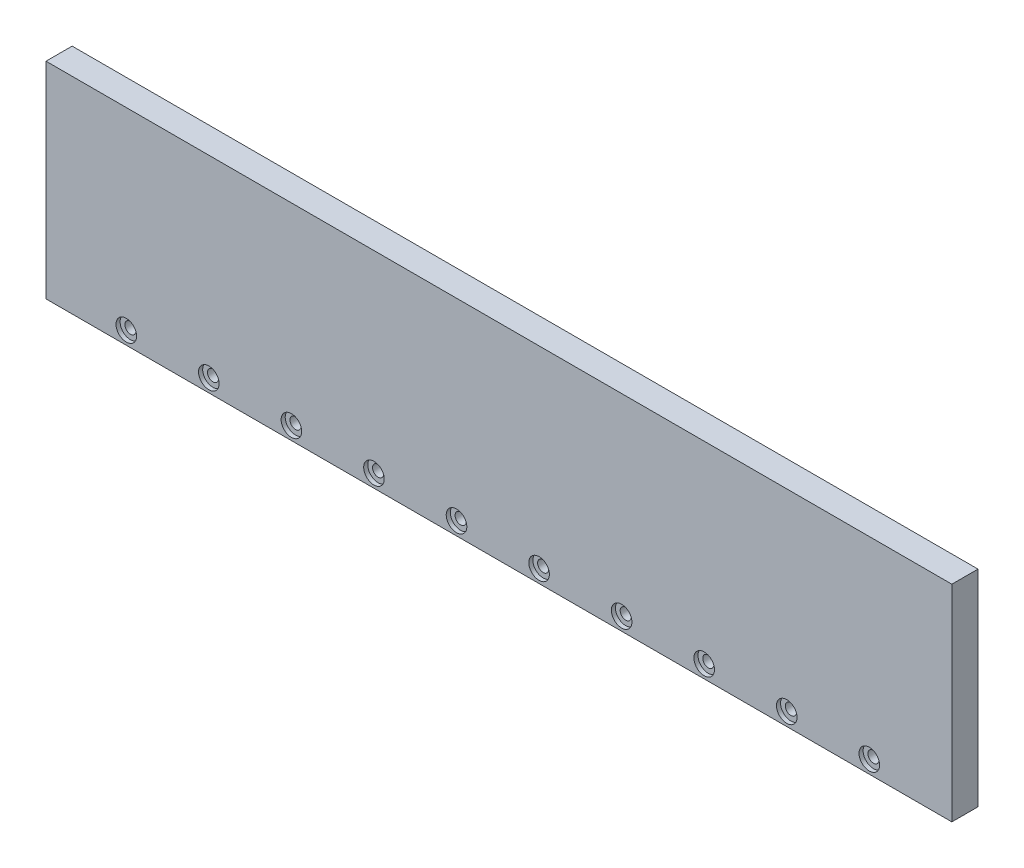
ISO-10303-21;
HEADER;
FILE_DESCRIPTION(('STEP AP214'),'2;1');
FILE_NAME('part.step','',(''),(''),'','','');
FILE_SCHEMA(('AUTOMOTIVE_DESIGN { 1 0 10303 214 1 1 1 1 }'));
ENDSEC;
DATA;
#1=APPLICATION_CONTEXT('core data for automotive mechanical design processes');
#2=APPLICATION_PROTOCOL_DEFINITION('international standard','automotive_design',2000,#1);
#3=PRODUCT_CONTEXT('',#1,'mechanical');
#4=PRODUCT('Part','Part','',(#3));
#5=PRODUCT_RELATED_PRODUCT_CATEGORY('part','',(#4));
#6=PRODUCT_DEFINITION_FORMATION('','',#4);
#7=PRODUCT_DEFINITION_CONTEXT('part definition',#1,'design');
#8=PRODUCT_DEFINITION('design','',#6,#7);
#9=PRODUCT_DEFINITION_SHAPE('','',#8);
#10=(LENGTH_UNIT() NAMED_UNIT(*) SI_UNIT(.MILLI.,.METRE.));
#11=(NAMED_UNIT(*) PLANE_ANGLE_UNIT() SI_UNIT($,.RADIAN.));
#12=(NAMED_UNIT(*) SI_UNIT($,.STERADIAN.) SOLID_ANGLE_UNIT());
#13=UNCERTAINTY_MEASURE_WITH_UNIT(LENGTH_MEASURE(1.E-05),#10,'distance_accuracy_value','');
#14=(GEOMETRIC_REPRESENTATION_CONTEXT(3) GLOBAL_UNCERTAINTY_ASSIGNED_CONTEXT((#13)) GLOBAL_UNIT_ASSIGNED_CONTEXT((#10,
#11,#12)) REPRESENTATION_CONTEXT('',''));
#15=CARTESIAN_POINT('',(0.,0.,0.));
#16=DIRECTION('',(0.,0.,1.));
#17=DIRECTION('',(1.,0.,0.));
#18=AXIS2_PLACEMENT_3D('',#15,#16,#17);
#19=CARTESIAN_POINT('',(110.,-25.,3.175));
#20=DIRECTION('',(-1.,0.,0.));
#21=DIRECTION('',(0.,0.,1.));
#22=AXIS2_PLACEMENT_3D('',#19,#20,#21);
#23=PLANE('',#22);
#24=DIRECTION('',(0.,1.,0.));
#25=VECTOR('',#24,1.);
#26=CARTESIAN_POINT('',(110.,-25.,-3.175));
#27=LINE('',#26,#25);
#28=CARTESIAN_POINT('',(110.,-25.,-3.175));
#29=VERTEX_POINT('',#28);
#30=CARTESIAN_POINT('',(110.,25.,-3.175));
#31=VERTEX_POINT('',#30);
#32=EDGE_CURVE('E112',#29,#31,#27,.T.);
#33=ORIENTED_EDGE('',*,*,#32,.T.);
#34=DIRECTION('',(0.,0.,-1.));
#35=VECTOR('',#34,1.);
#36=CARTESIAN_POINT('',(110.,25.,3.175));
#37=LINE('',#36,#35);
#38=CARTESIAN_POINT('',(110.,25.,3.175));
#39=VERTEX_POINT('',#38);
#40=EDGE_CURVE('E11',#39,#31,#37,.T.);
#41=ORIENTED_EDGE('',*,*,#40,.F.);
#42=DIRECTION('',(0.,1.,0.));
#43=VECTOR('',#42,1.);
#44=CARTESIAN_POINT('',(110.,-25.,3.175));
#45=LINE('',#44,#43);
#46=CARTESIAN_POINT('',(110.,-25.,3.175));
#47=VERTEX_POINT('',#46);
#48=EDGE_CURVE('E94',#47,#39,#45,.T.);
#49=ORIENTED_EDGE('',*,*,#48,.F.);
#50=DIRECTION('',(0.,0.,-1.));
#51=VECTOR('',#50,1.);
#52=CARTESIAN_POINT('',(110.,-25.,3.175));
#53=LINE('',#52,#51);
#54=EDGE_CURVE('E108',#47,#29,#53,.T.);
#55=ORIENTED_EDGE('',*,*,#54,.T.);
#56=EDGE_LOOP('',(#33,#41,#49,#55));
#57=FACE_BOUND('',#56,.T.);
#58=ADVANCED_FACE('F38',(#57),#23,.F.);
#59=CARTESIAN_POINT('',(-110.,25.,3.175));
#60=DIRECTION('',(0.,-1.,0.));
#61=DIRECTION('',(0.,0.,-1.));
#62=AXIS2_PLACEMENT_3D('',#59,#60,#61);
#63=PLANE('',#62);
#64=DIRECTION('',(-1.,0.,0.));
#65=VECTOR('',#64,1.);
#66=CARTESIAN_POINT('',(-110.,25.,-3.175));
#67=LINE('',#66,#65);
#68=CARTESIAN_POINT('',(-110.,25.,-3.175));
#69=VERTEX_POINT('',#68);
#70=EDGE_CURVE('E99',#31,#69,#67,.T.);
#71=ORIENTED_EDGE('',*,*,#70,.T.);
#72=DIRECTION('',(0.,0.,-1.));
#73=VECTOR('',#72,1.);
#74=CARTESIAN_POINT('',(-110.,25.,3.175));
#75=LINE('',#74,#73);
#76=CARTESIAN_POINT('',(-110.,25.,3.175));
#77=VERTEX_POINT('',#76);
#78=EDGE_CURVE('E47',#77,#69,#75,.T.);
#79=ORIENTED_EDGE('',*,*,#78,.F.);
#80=DIRECTION('',(-1.,0.,0.));
#81=VECTOR('',#80,1.);
#82=CARTESIAN_POINT('',(-110.,25.,3.175));
#83=LINE('',#82,#81);
#84=EDGE_CURVE('E89',#39,#77,#83,.T.);
#85=ORIENTED_EDGE('',*,*,#84,.F.);
#86=ORIENTED_EDGE('',*,*,#40,.T.);
#87=EDGE_LOOP('',(#71,#79,#85,#86));
#88=FACE_BOUND('',#87,.T.);
#89=ADVANCED_FACE('F98',(#88),#63,.F.);
#90=CARTESIAN_POINT('',(-110.,-25.,3.175));
#91=DIRECTION('',(1.,0.,0.));
#92=DIRECTION('',(0.,0.,-1.));
#93=AXIS2_PLACEMENT_3D('',#90,#91,#92);
#94=PLANE('',#93);
#95=DIRECTION('',(0.,-1.,0.));
#96=VECTOR('',#95,1.);
#97=CARTESIAN_POINT('',(-110.,-25.,-3.175));
#98=LINE('',#97,#96);
#99=CARTESIAN_POINT('',(-110.,-25.,-3.175));
#100=VERTEX_POINT('',#99);
#101=EDGE_CURVE('E76',#69,#100,#98,.T.);
#102=ORIENTED_EDGE('',*,*,#101,.T.);
#103=DIRECTION('',(0.,0.,-1.));
#104=VECTOR('',#103,1.);
#105=CARTESIAN_POINT('',(-110.,-25.,3.175));
#106=LINE('',#105,#104);
#107=CARTESIAN_POINT('',(-110.,-25.,3.175));
#108=VERTEX_POINT('',#107);
#109=EDGE_CURVE('E100',#108,#100,#106,.T.);
#110=ORIENTED_EDGE('',*,*,#109,.F.);
#111=DIRECTION('',(0.,-1.,0.));
#112=VECTOR('',#111,1.);
#113=CARTESIAN_POINT('',(-110.,-25.,3.175));
#114=LINE('',#113,#112);
#115=EDGE_CURVE('E92',#77,#108,#114,.T.);
#116=ORIENTED_EDGE('',*,*,#115,.F.);
#117=ORIENTED_EDGE('',*,*,#78,.T.);
#118=EDGE_LOOP('',(#102,#110,#116,#117));
#119=FACE_BOUND('',#118,.T.);
#120=ADVANCED_FACE('F102',(#119),#94,.F.);
#121=CARTESIAN_POINT('',(-110.,-25.,3.175));
#122=DIRECTION('',(0.,1.,0.));
#123=DIRECTION('',(0.,0.,1.));
#124=AXIS2_PLACEMENT_3D('',#121,#122,#123);
#125=PLANE('',#124);
#126=DIRECTION('',(1.,0.,0.));
#127=VECTOR('',#126,1.);
#128=CARTESIAN_POINT('',(-110.,-25.,-3.175));
#129=LINE('',#128,#127);
#130=EDGE_CURVE('E82',#100,#29,#129,.T.);
#131=ORIENTED_EDGE('',*,*,#130,.T.);
#132=ORIENTED_EDGE('',*,*,#54,.F.);
#133=DIRECTION('',(1.,0.,0.));
#134=VECTOR('',#133,1.);
#135=CARTESIAN_POINT('',(-110.,-25.,3.175));
#136=LINE('',#135,#134);
#137=EDGE_CURVE('E58',#108,#47,#136,.T.);
#138=ORIENTED_EDGE('',*,*,#137,.F.);
#139=ORIENTED_EDGE('',*,*,#109,.T.);
#140=EDGE_LOOP('',(#131,#132,#138,#139));
#141=FACE_BOUND('',#140,.T.);
#142=ADVANCED_FACE('F293',(#141),#125,.F.);
#143=CARTESIAN_POINT('',(0.,0.,3.175));
#144=DIRECTION('',(0.,0.,-1.));
#145=DIRECTION('',(-1.,0.,0.));
#146=AXIS2_PLACEMENT_3D('',#143,#144,#145);
#147=PLANE('',#146);
#148=CARTESIAN_POINT('',(89.95,-21.825,3.175));
#149=DIRECTION('',(0.,0.,1.));
#150=DIRECTION('',(1.,0.,0.));
#151=AXIS2_PLACEMENT_3D('',#148,#149,#150);
#152=CIRCLE('',#151,2.5);
#153=CARTESIAN_POINT('',(92.45,-21.825,3.175));
#154=VERTEX_POINT('',#153);
#155=EDGE_CURVE('E277',#154,#154,#152,.T.);
#156=ORIENTED_EDGE('',*,*,#155,.F.);
#157=EDGE_LOOP('',(#156));
#158=FACE_BOUND('',#157,.T.);
#159=CARTESIAN_POINT('',(69.9,-21.825,3.175));
#160=DIRECTION('',(0.,0.,1.));
#161=DIRECTION('',(1.,0.,0.));
#162=AXIS2_PLACEMENT_3D('',#159,#160,#161);
#163=CIRCLE('',#162,2.5);
#164=CARTESIAN_POINT('',(72.4,-21.825,3.175));
#165=VERTEX_POINT('',#164);
#166=EDGE_CURVE('E189',#165,#165,#163,.T.);
#167=ORIENTED_EDGE('',*,*,#166,.F.);
#168=EDGE_LOOP('',(#167));
#169=FACE_BOUND('',#168,.T.);
#170=CARTESIAN_POINT('',(49.85,-21.825,3.175));
#171=DIRECTION('',(0.,0.,1.));
#172=DIRECTION('',(1.,0.,0.));
#173=AXIS2_PLACEMENT_3D('',#170,#171,#172);
#174=CIRCLE('',#173,2.5);
#175=CARTESIAN_POINT('',(52.35,-21.825,3.175));
#176=VERTEX_POINT('',#175);
#177=EDGE_CURVE('E172',#176,#176,#174,.T.);
#178=ORIENTED_EDGE('',*,*,#177,.F.);
#179=EDGE_LOOP('',(#178));
#180=FACE_BOUND('',#179,.T.);
#181=CARTESIAN_POINT('',(29.8,-21.825,3.175));
#182=DIRECTION('',(0.,0.,1.));
#183=DIRECTION('',(1.,0.,0.));
#184=AXIS2_PLACEMENT_3D('',#181,#182,#183);
#185=CIRCLE('',#184,2.5);
#186=CARTESIAN_POINT('',(32.3,-21.825,3.175));
#187=VERTEX_POINT('',#186);
#188=EDGE_CURVE('E167',#187,#187,#185,.T.);
#189=ORIENTED_EDGE('',*,*,#188,.F.);
#190=EDGE_LOOP('',(#189));
#191=FACE_BOUND('',#190,.T.);
#192=CARTESIAN_POINT('',(9.75000000000005,-21.825,3.175));
#193=DIRECTION('',(0.,0.,1.));
#194=DIRECTION('',(1.,0.,0.));
#195=AXIS2_PLACEMENT_3D('',#192,#193,#194);
#196=CIRCLE('',#195,2.5);
#197=CARTESIAN_POINT('',(12.2500000000001,-21.825,3.175));
#198=VERTEX_POINT('',#197);
#199=EDGE_CURVE('E162',#198,#198,#196,.T.);
#200=ORIENTED_EDGE('',*,*,#199,.F.);
#201=EDGE_LOOP('',(#200));
#202=FACE_BOUND('',#201,.T.);
#203=CARTESIAN_POINT('',(-10.2999999999999,-21.825,3.175));
#204=DIRECTION('',(0.,0.,1.));
#205=DIRECTION('',(1.,0.,0.));
#206=AXIS2_PLACEMENT_3D('',#203,#204,#205);
#207=CIRCLE('',#206,2.5);
#208=CARTESIAN_POINT('',(-7.79999999999993,-21.825,3.175));
#209=VERTEX_POINT('',#208);
#210=EDGE_CURVE('E156',#209,#209,#207,.T.);
#211=ORIENTED_EDGE('',*,*,#210,.F.);
#212=EDGE_LOOP('',(#211));
#213=FACE_BOUND('',#212,.T.);
#214=CARTESIAN_POINT('',(-30.3499999999999,-21.825,3.175));
#215=DIRECTION('',(0.,0.,1.));
#216=DIRECTION('',(1.,0.,0.));
#217=AXIS2_PLACEMENT_3D('',#214,#215,#216);
#218=CIRCLE('',#217,2.5);
#219=CARTESIAN_POINT('',(-27.8499999999999,-21.825,3.175));
#220=VERTEX_POINT('',#219);
#221=EDGE_CURVE('E150',#220,#220,#218,.T.);
#222=ORIENTED_EDGE('',*,*,#221,.F.);
#223=EDGE_LOOP('',(#222));
#224=FACE_BOUND('',#223,.T.);
#225=CARTESIAN_POINT('',(-50.3999999999999,-21.825,3.175));
#226=DIRECTION('',(0.,0.,1.));
#227=DIRECTION('',(1.,0.,0.));
#228=AXIS2_PLACEMENT_3D('',#225,#226,#227);
#229=CIRCLE('',#228,2.5);
#230=CARTESIAN_POINT('',(-47.8999999999999,-21.825,3.175));
#231=VERTEX_POINT('',#230);
#232=EDGE_CURVE('E144',#231,#231,#229,.T.);
#233=ORIENTED_EDGE('',*,*,#232,.F.);
#234=EDGE_LOOP('',(#233));
#235=FACE_BOUND('',#234,.T.);
#236=CARTESIAN_POINT('',(-70.4499999999999,-21.825,3.175));
#237=DIRECTION('',(0.,0.,1.));
#238=DIRECTION('',(1.,0.,0.));
#239=AXIS2_PLACEMENT_3D('',#236,#237,#238);
#240=CIRCLE('',#239,2.5);
#241=CARTESIAN_POINT('',(-67.9499999999999,-21.825,3.175));
#242=VERTEX_POINT('',#241);
#243=EDGE_CURVE('E138',#242,#242,#240,.T.);
#244=ORIENTED_EDGE('',*,*,#243,.F.);
#245=EDGE_LOOP('',(#244));
#246=FACE_BOUND('',#245,.T.);
#247=CARTESIAN_POINT('',(-90.4999999999999,-21.825,3.175));
#248=DIRECTION('',(0.,0.,1.));
#249=DIRECTION('',(1.,0.,0.));
#250=AXIS2_PLACEMENT_3D('',#247,#248,#249);
#251=CIRCLE('',#250,2.5);
#252=CARTESIAN_POINT('',(-87.9999999999999,-21.825,3.175));
#253=VERTEX_POINT('',#252);
#254=EDGE_CURVE('E132',#253,#253,#251,.T.);
#255=ORIENTED_EDGE('',*,*,#254,.F.);
#256=EDGE_LOOP('',(#255));
#257=FACE_BOUND('',#256,.T.);
#258=ORIENTED_EDGE('',*,*,#48,.T.);
#259=ORIENTED_EDGE('',*,*,#84,.T.);
#260=ORIENTED_EDGE('',*,*,#115,.T.);
#261=ORIENTED_EDGE('',*,*,#137,.T.);
#262=EDGE_LOOP('',(#258,#259,#260,#261));
#263=FACE_BOUND('',#262,.T.);
#264=ADVANCED_FACE('F90',(#158,#169,#180,#191,#202,#213,#224,#235,#246,#257,#263),#147,.F.);
#265=CARTESIAN_POINT('',(0.,0.,-3.175));
#266=DIRECTION('',(0.,0.,-1.));
#267=DIRECTION('',(-1.,0.,0.));
#268=AXIS2_PLACEMENT_3D('',#265,#266,#267);
#269=PLANE('',#268);
#270=CARTESIAN_POINT('',(89.95,-21.825,-3.175));
#271=DIRECTION('',(0.,0.,-1.));
#272=DIRECTION('',(-1.,0.,0.));
#273=AXIS2_PLACEMENT_3D('',#270,#271,#272);
#274=CIRCLE('',#273,1.35);
#275=CARTESIAN_POINT('',(88.6,-21.825,-3.175));
#276=VERTEX_POINT('',#275);
#277=EDGE_CURVE('E41',#276,#276,#274,.T.);
#278=ORIENTED_EDGE('',*,*,#277,.F.);
#279=EDGE_LOOP('',(#278));
#280=FACE_BOUND('',#279,.T.);
#281=CARTESIAN_POINT('',(69.9,-21.825,-3.175));
#282=DIRECTION('',(0.,0.,-1.));
#283=DIRECTION('',(-1.,0.,0.));
#284=AXIS2_PLACEMENT_3D('',#281,#282,#283);
#285=CIRCLE('',#284,1.35);
#286=CARTESIAN_POINT('',(68.55,-21.825,-3.175));
#287=VERTEX_POINT('',#286);
#288=EDGE_CURVE('E169',#287,#287,#285,.T.);
#289=ORIENTED_EDGE('',*,*,#288,.F.);
#290=EDGE_LOOP('',(#289));
#291=FACE_BOUND('',#290,.T.);
#292=CARTESIAN_POINT('',(49.85,-21.825,-3.175));
#293=DIRECTION('',(0.,0.,-1.));
#294=DIRECTION('',(-1.,0.,0.));
#295=AXIS2_PLACEMENT_3D('',#292,#293,#294);
#296=CIRCLE('',#295,1.35);
#297=CARTESIAN_POINT('',(48.5,-21.825,-3.175));
#298=VERTEX_POINT('',#297);
#299=EDGE_CURVE('E164',#298,#298,#296,.T.);
#300=ORIENTED_EDGE('',*,*,#299,.F.);
#301=EDGE_LOOP('',(#300));
#302=FACE_BOUND('',#301,.T.);
#303=CARTESIAN_POINT('',(29.8,-21.825,-3.175));
#304=DIRECTION('',(0.,0.,-1.));
#305=DIRECTION('',(-1.,0.,0.));
#306=AXIS2_PLACEMENT_3D('',#303,#304,#305);
#307=CIRCLE('',#306,1.35);
#308=CARTESIAN_POINT('',(28.45,-21.825,-3.175));
#309=VERTEX_POINT('',#308);
#310=EDGE_CURVE('E158',#309,#309,#307,.T.);
#311=ORIENTED_EDGE('',*,*,#310,.F.);
#312=EDGE_LOOP('',(#311));
#313=FACE_BOUND('',#312,.T.);
#314=CARTESIAN_POINT('',(9.75000000000005,-21.825,-3.175));
#315=DIRECTION('',(0.,0.,-1.));
#316=DIRECTION('',(-1.,0.,0.));
#317=AXIS2_PLACEMENT_3D('',#314,#315,#316);
#318=CIRCLE('',#317,1.35);
#319=CARTESIAN_POINT('',(8.40000000000006,-21.825,-3.175));
#320=VERTEX_POINT('',#319);
#321=EDGE_CURVE('E152',#320,#320,#318,.T.);
#322=ORIENTED_EDGE('',*,*,#321,.F.);
#323=EDGE_LOOP('',(#322));
#324=FACE_BOUND('',#323,.T.);
#325=CARTESIAN_POINT('',(-10.2999999999999,-21.825,-3.175));
#326=DIRECTION('',(0.,0.,-1.));
#327=DIRECTION('',(-1.,0.,0.));
#328=AXIS2_PLACEMENT_3D('',#325,#326,#327);
#329=CIRCLE('',#328,1.35);
#330=CARTESIAN_POINT('',(-11.6499999999999,-21.825,-3.175));
#331=VERTEX_POINT('',#330);
#332=EDGE_CURVE('E146',#331,#331,#329,.T.);
#333=ORIENTED_EDGE('',*,*,#332,.F.);
#334=EDGE_LOOP('',(#333));
#335=FACE_BOUND('',#334,.T.);
#336=CARTESIAN_POINT('',(-30.3499999999999,-21.825,-3.175));
#337=DIRECTION('',(0.,0.,-1.));
#338=DIRECTION('',(-1.,0.,0.));
#339=AXIS2_PLACEMENT_3D('',#336,#337,#338);
#340=CIRCLE('',#339,1.35);
#341=CARTESIAN_POINT('',(-31.6999999999999,-21.825,-3.175));
#342=VERTEX_POINT('',#341);
#343=EDGE_CURVE('E140',#342,#342,#340,.T.);
#344=ORIENTED_EDGE('',*,*,#343,.F.);
#345=EDGE_LOOP('',(#344));
#346=FACE_BOUND('',#345,.T.);
#347=CARTESIAN_POINT('',(-50.3999999999999,-21.825,-3.175));
#348=DIRECTION('',(0.,0.,-1.));
#349=DIRECTION('',(-1.,0.,0.));
#350=AXIS2_PLACEMENT_3D('',#347,#348,#349);
#351=CIRCLE('',#350,1.35);
#352=CARTESIAN_POINT('',(-51.7499999999999,-21.825,-3.175));
#353=VERTEX_POINT('',#352);
#354=EDGE_CURVE('E134',#353,#353,#351,.T.);
#355=ORIENTED_EDGE('',*,*,#354,.F.);
#356=EDGE_LOOP('',(#355));
#357=FACE_BOUND('',#356,.T.);
#358=CARTESIAN_POINT('',(-70.4499999999999,-21.825,-3.175));
#359=DIRECTION('',(0.,0.,-1.));
#360=DIRECTION('',(-1.,0.,0.));
#361=AXIS2_PLACEMENT_3D('',#358,#359,#360);
#362=CIRCLE('',#361,1.35);
#363=CARTESIAN_POINT('',(-71.7999999999999,-21.825,-3.175));
#364=VERTEX_POINT('',#363);
#365=EDGE_CURVE('E128',#364,#364,#362,.T.);
#366=ORIENTED_EDGE('',*,*,#365,.F.);
#367=EDGE_LOOP('',(#366));
#368=FACE_BOUND('',#367,.T.);
#369=CARTESIAN_POINT('',(-90.4999999999999,-21.825,-3.175));
#370=DIRECTION('',(0.,0.,-1.));
#371=DIRECTION('',(-1.,0.,0.));
#372=AXIS2_PLACEMENT_3D('',#369,#370,#371);
#373=CIRCLE('',#372,1.35);
#374=CARTESIAN_POINT('',(-91.8499999999999,-21.825,-3.175));
#375=VERTEX_POINT('',#374);
#376=EDGE_CURVE('E115',#375,#375,#373,.T.);
#377=ORIENTED_EDGE('',*,*,#376,.F.);
#378=EDGE_LOOP('',(#377));
#379=FACE_BOUND('',#378,.T.);
#380=ORIENTED_EDGE('',*,*,#32,.F.);
#381=ORIENTED_EDGE('',*,*,#130,.F.);
#382=ORIENTED_EDGE('',*,*,#101,.F.);
#383=ORIENTED_EDGE('',*,*,#70,.F.);
#384=EDGE_LOOP('',(#380,#381,#382,#383));
#385=FACE_BOUND('',#384,.T.);
#386=ADVANCED_FACE('F292',(#280,#291,#302,#313,#324,#335,#346,#357,#368,#379,#385),#269,.T.);
#387=CARTESIAN_POINT('',(-90.4999999999999,-21.825,3.175));
#388=DIRECTION('',(0.,0.,1.));
#389=DIRECTION('',(1.,0.,0.));
#390=AXIS2_PLACEMENT_3D('',#387,#388,#389);
#391=CYLINDRICAL_SURFACE('',#390,1.35);
#392=ORIENTED_EDGE('',*,*,#376,.T.);
#393=EDGE_LOOP('',(#392));
#394=FACE_BOUND('',#393,.T.);
#395=CARTESIAN_POINT('',(-90.4999999999999,-21.825,2.175));
#396=DIRECTION('',(0.,0.,1.));
#397=DIRECTION('',(1.,0.,0.));
#398=AXIS2_PLACEMENT_3D('',#395,#396,#397);
#399=CIRCLE('',#398,1.35);
#400=CARTESIAN_POINT('',(-89.1499999999999,-21.825,2.175));
#401=VERTEX_POINT('',#400);
#402=EDGE_CURVE('E127',#401,#401,#399,.T.);
#403=ORIENTED_EDGE('',*,*,#402,.T.);
#404=EDGE_LOOP('',(#403));
#405=FACE_BOUND('',#404,.T.);
#406=ADVANCED_FACE('F325',(#394,#405),#391,.F.);
#407=CARTESIAN_POINT('',(-89.1499999999999,-21.825,2.175));
#408=DIRECTION('',(0.,0.,-1.));
#409=DIRECTION('',(-1.,0.,0.));
#410=AXIS2_PLACEMENT_3D('',#407,#408,#409);
#411=PLANE('',#410);
#412=ORIENTED_EDGE('',*,*,#402,.F.);
#413=EDGE_LOOP('',(#412));
#414=FACE_BOUND('',#413,.T.);
#415=CARTESIAN_POINT('',(-90.4999999999999,-21.825,2.175));
#416=DIRECTION('',(0.,0.,1.));
#417=DIRECTION('',(1.,0.,0.));
#418=AXIS2_PLACEMENT_3D('',#415,#416,#417);
#419=CIRCLE('',#418,2.5);
#420=CARTESIAN_POINT('',(-87.9999999999999,-21.825,2.175));
#421=VERTEX_POINT('',#420);
#422=EDGE_CURVE('E262',#421,#421,#419,.T.);
#423=ORIENTED_EDGE('',*,*,#422,.T.);
#424=EDGE_LOOP('',(#423));
#425=FACE_BOUND('',#424,.T.);
#426=ADVANCED_FACE('F315',(#414,#425),#411,.F.);
#427=CARTESIAN_POINT('',(-90.4999999999999,-21.825,3.175));
#428=DIRECTION('',(0.,0.,1.));
#429=DIRECTION('',(1.,0.,0.));
#430=AXIS2_PLACEMENT_3D('',#427,#428,#429);
#431=CYLINDRICAL_SURFACE('',#430,2.5);
#432=ORIENTED_EDGE('',*,*,#422,.F.);
#433=EDGE_LOOP('',(#432));
#434=FACE_BOUND('',#433,.T.);
#435=ORIENTED_EDGE('',*,*,#254,.T.);
#436=EDGE_LOOP('',(#435));
#437=FACE_BOUND('',#436,.T.);
#438=ADVANCED_FACE('F312',(#434,#437),#431,.F.);
#439=CARTESIAN_POINT('',(-70.4499999999999,-21.825,3.175));
#440=DIRECTION('',(0.,0.,1.));
#441=DIRECTION('',(1.,0.,0.));
#442=AXIS2_PLACEMENT_3D('',#439,#440,#441);
#443=CYLINDRICAL_SURFACE('',#442,1.35);
#444=ORIENTED_EDGE('',*,*,#365,.T.);
#445=EDGE_LOOP('',(#444));
#446=FACE_BOUND('',#445,.T.);
#447=CARTESIAN_POINT('',(-70.4499999999999,-21.825,2.175));
#448=DIRECTION('',(0.,0.,1.));
#449=DIRECTION('',(1.,0.,0.));
#450=AXIS2_PLACEMENT_3D('',#447,#448,#449);
#451=CIRCLE('',#450,1.35);
#452=CARTESIAN_POINT('',(-69.0999999999999,-21.825,2.175));
#453=VERTEX_POINT('',#452);
#454=EDGE_CURVE('E133',#453,#453,#451,.T.);
#455=ORIENTED_EDGE('',*,*,#454,.T.);
#456=EDGE_LOOP('',(#455));
#457=FACE_BOUND('',#456,.T.);
#458=ADVANCED_FACE('F314',(#446,#457),#443,.F.);
#459=CARTESIAN_POINT('',(-69.0999999999999,-21.825,2.175));
#460=DIRECTION('',(0.,0.,-1.));
#461=DIRECTION('',(-1.,0.,0.));
#462=AXIS2_PLACEMENT_3D('',#459,#460,#461);
#463=PLANE('',#462);
#464=ORIENTED_EDGE('',*,*,#454,.F.);
#465=EDGE_LOOP('',(#464));
#466=FACE_BOUND('',#465,.T.);
#467=CARTESIAN_POINT('',(-70.4499999999999,-21.825,2.175));
#468=DIRECTION('',(0.,0.,1.));
#469=DIRECTION('',(1.,0.,0.));
#470=AXIS2_PLACEMENT_3D('',#467,#468,#469);
#471=CIRCLE('',#470,2.5);
#472=CARTESIAN_POINT('',(-67.9499999999999,-21.825,2.175));
#473=VERTEX_POINT('',#472);
#474=EDGE_CURVE('E252',#473,#473,#471,.T.);
#475=ORIENTED_EDGE('',*,*,#474,.T.);
#476=EDGE_LOOP('',(#475));
#477=FACE_BOUND('',#476,.T.);
#478=ADVANCED_FACE('F322',(#466,#477),#463,.F.);
#479=CARTESIAN_POINT('',(-70.4499999999999,-21.825,3.175));
#480=DIRECTION('',(0.,0.,1.));
#481=DIRECTION('',(1.,0.,0.));
#482=AXIS2_PLACEMENT_3D('',#479,#480,#481);
#483=CYLINDRICAL_SURFACE('',#482,2.5);
#484=ORIENTED_EDGE('',*,*,#474,.F.);
#485=EDGE_LOOP('',(#484));
#486=FACE_BOUND('',#485,.T.);
#487=ORIENTED_EDGE('',*,*,#243,.T.);
#488=EDGE_LOOP('',(#487));
#489=FACE_BOUND('',#488,.T.);
#490=ADVANCED_FACE('F394',(#486,#489),#483,.F.);
#491=CARTESIAN_POINT('',(-50.3999999999999,-21.825,3.175));
#492=DIRECTION('',(0.,0.,1.));
#493=DIRECTION('',(1.,0.,0.));
#494=AXIS2_PLACEMENT_3D('',#491,#492,#493);
#495=CYLINDRICAL_SURFACE('',#494,1.35);
#496=ORIENTED_EDGE('',*,*,#354,.T.);
#497=EDGE_LOOP('',(#496));
#498=FACE_BOUND('',#497,.T.);
#499=CARTESIAN_POINT('',(-50.3999999999999,-21.825,2.175));
#500=DIRECTION('',(0.,0.,1.));
#501=DIRECTION('',(1.,0.,0.));
#502=AXIS2_PLACEMENT_3D('',#499,#500,#501);
#503=CIRCLE('',#502,1.35);
#504=CARTESIAN_POINT('',(-49.0499999999999,-21.825,2.175));
#505=VERTEX_POINT('',#504);
#506=EDGE_CURVE('E139',#505,#505,#503,.T.);
#507=ORIENTED_EDGE('',*,*,#506,.T.);
#508=EDGE_LOOP('',(#507));
#509=FACE_BOUND('',#508,.T.);
#510=ADVANCED_FACE('F404',(#498,#509),#495,.F.);
#511=CARTESIAN_POINT('',(-49.0499999999999,-21.825,2.175));
#512=DIRECTION('',(0.,0.,-1.));
#513=DIRECTION('',(-1.,0.,0.));
#514=AXIS2_PLACEMENT_3D('',#511,#512,#513);
#515=PLANE('',#514);
#516=ORIENTED_EDGE('',*,*,#506,.F.);
#517=EDGE_LOOP('',(#516));
#518=FACE_BOUND('',#517,.T.);
#519=CARTESIAN_POINT('',(-50.3999999999999,-21.825,2.175));
#520=DIRECTION('',(0.,0.,1.));
#521=DIRECTION('',(1.,0.,0.));
#522=AXIS2_PLACEMENT_3D('',#519,#520,#521);
#523=CIRCLE('',#522,2.5);
#524=CARTESIAN_POINT('',(-47.8999999999999,-21.825,2.175));
#525=VERTEX_POINT('',#524);
#526=EDGE_CURVE('E242',#525,#525,#523,.T.);
#527=ORIENTED_EDGE('',*,*,#526,.T.);
#528=EDGE_LOOP('',(#527));
#529=FACE_BOUND('',#528,.T.);
#530=ADVANCED_FACE('F414',(#518,#529),#515,.F.);
#531=CARTESIAN_POINT('',(-50.3999999999999,-21.825,3.175));
#532=DIRECTION('',(0.,0.,1.));
#533=DIRECTION('',(1.,0.,0.));
#534=AXIS2_PLACEMENT_3D('',#531,#532,#533);
#535=CYLINDRICAL_SURFACE('',#534,2.5);
#536=ORIENTED_EDGE('',*,*,#526,.F.);
#537=EDGE_LOOP('',(#536));
#538=FACE_BOUND('',#537,.T.);
#539=ORIENTED_EDGE('',*,*,#232,.T.);
#540=EDGE_LOOP('',(#539));
#541=FACE_BOUND('',#540,.T.);
#542=ADVANCED_FACE('F424',(#538,#541),#535,.F.);
#543=CARTESIAN_POINT('',(-30.3499999999999,-21.825,3.175));
#544=DIRECTION('',(0.,0.,1.));
#545=DIRECTION('',(1.,0.,0.));
#546=AXIS2_PLACEMENT_3D('',#543,#544,#545);
#547=CYLINDRICAL_SURFACE('',#546,1.35);
#548=ORIENTED_EDGE('',*,*,#343,.T.);
#549=EDGE_LOOP('',(#548));
#550=FACE_BOUND('',#549,.T.);
#551=CARTESIAN_POINT('',(-30.3499999999999,-21.825,2.175));
#552=DIRECTION('',(0.,0.,1.));
#553=DIRECTION('',(1.,0.,0.));
#554=AXIS2_PLACEMENT_3D('',#551,#552,#553);
#555=CIRCLE('',#554,1.35);
#556=CARTESIAN_POINT('',(-28.9999999999999,-21.825,2.175));
#557=VERTEX_POINT('',#556);
#558=EDGE_CURVE('E145',#557,#557,#555,.T.);
#559=ORIENTED_EDGE('',*,*,#558,.T.);
#560=EDGE_LOOP('',(#559));
#561=FACE_BOUND('',#560,.T.);
#562=ADVANCED_FACE('F434',(#550,#561),#547,.F.);
#563=CARTESIAN_POINT('',(-28.9999999999999,-21.825,2.175));
#564=DIRECTION('',(0.,0.,-1.));
#565=DIRECTION('',(-1.,0.,0.));
#566=AXIS2_PLACEMENT_3D('',#563,#564,#565);
#567=PLANE('',#566);
#568=ORIENTED_EDGE('',*,*,#558,.F.);
#569=EDGE_LOOP('',(#568));
#570=FACE_BOUND('',#569,.T.);
#571=CARTESIAN_POINT('',(-30.3499999999999,-21.825,2.175));
#572=DIRECTION('',(0.,0.,1.));
#573=DIRECTION('',(1.,0.,0.));
#574=AXIS2_PLACEMENT_3D('',#571,#572,#573);
#575=CIRCLE('',#574,2.5);
#576=CARTESIAN_POINT('',(-27.8499999999999,-21.825,2.175));
#577=VERTEX_POINT('',#576);
#578=EDGE_CURVE('E232',#577,#577,#575,.T.);
#579=ORIENTED_EDGE('',*,*,#578,.T.);
#580=EDGE_LOOP('',(#579));
#581=FACE_BOUND('',#580,.T.);
#582=ADVANCED_FACE('F444',(#570,#581),#567,.F.);
#583=CARTESIAN_POINT('',(-30.3499999999999,-21.825,3.175));
#584=DIRECTION('',(0.,0.,1.));
#585=DIRECTION('',(1.,0.,0.));
#586=AXIS2_PLACEMENT_3D('',#583,#584,#585);
#587=CYLINDRICAL_SURFACE('',#586,2.5);
#588=ORIENTED_EDGE('',*,*,#578,.F.);
#589=EDGE_LOOP('',(#588));
#590=FACE_BOUND('',#589,.T.);
#591=ORIENTED_EDGE('',*,*,#221,.T.);
#592=EDGE_LOOP('',(#591));
#593=FACE_BOUND('',#592,.T.);
#594=ADVANCED_FACE('F454',(#590,#593),#587,.F.);
#595=CARTESIAN_POINT('',(-10.2999999999999,-21.825,3.175));
#596=DIRECTION('',(0.,0.,1.));
#597=DIRECTION('',(1.,0.,0.));
#598=AXIS2_PLACEMENT_3D('',#595,#596,#597);
#599=CYLINDRICAL_SURFACE('',#598,1.35);
#600=ORIENTED_EDGE('',*,*,#332,.T.);
#601=EDGE_LOOP('',(#600));
#602=FACE_BOUND('',#601,.T.);
#603=CARTESIAN_POINT('',(-10.2999999999999,-21.825,2.175));
#604=DIRECTION('',(0.,0.,1.));
#605=DIRECTION('',(1.,0.,0.));
#606=AXIS2_PLACEMENT_3D('',#603,#604,#605);
#607=CIRCLE('',#606,1.35);
#608=CARTESIAN_POINT('',(-8.94999999999993,-21.825,2.175));
#609=VERTEX_POINT('',#608);
#610=EDGE_CURVE('E151',#609,#609,#607,.T.);
#611=ORIENTED_EDGE('',*,*,#610,.T.);
#612=EDGE_LOOP('',(#611));
#613=FACE_BOUND('',#612,.T.);
#614=ADVANCED_FACE('F464',(#602,#613),#599,.F.);
#615=CARTESIAN_POINT('',(-8.94999999999993,-21.825,2.175));
#616=DIRECTION('',(0.,0.,-1.));
#617=DIRECTION('',(-1.,0.,0.));
#618=AXIS2_PLACEMENT_3D('',#615,#616,#617);
#619=PLANE('',#618);
#620=ORIENTED_EDGE('',*,*,#610,.F.);
#621=EDGE_LOOP('',(#620));
#622=FACE_BOUND('',#621,.T.);
#623=CARTESIAN_POINT('',(-10.2999999999999,-21.825,2.175));
#624=DIRECTION('',(0.,0.,1.));
#625=DIRECTION('',(1.,0.,0.));
#626=AXIS2_PLACEMENT_3D('',#623,#624,#625);
#627=CIRCLE('',#626,2.5);
#628=CARTESIAN_POINT('',(-7.79999999999993,-21.825,2.175));
#629=VERTEX_POINT('',#628);
#630=EDGE_CURVE('E222',#629,#629,#627,.T.);
#631=ORIENTED_EDGE('',*,*,#630,.T.);
#632=EDGE_LOOP('',(#631));
#633=FACE_BOUND('',#632,.T.);
#634=ADVANCED_FACE('F474',(#622,#633),#619,.F.);
#635=CARTESIAN_POINT('',(-10.2999999999999,-21.825,3.175));
#636=DIRECTION('',(0.,0.,1.));
#637=DIRECTION('',(1.,0.,0.));
#638=AXIS2_PLACEMENT_3D('',#635,#636,#637);
#639=CYLINDRICAL_SURFACE('',#638,2.5);
#640=ORIENTED_EDGE('',*,*,#630,.F.);
#641=EDGE_LOOP('',(#640));
#642=FACE_BOUND('',#641,.T.);
#643=ORIENTED_EDGE('',*,*,#210,.T.);
#644=EDGE_LOOP('',(#643));
#645=FACE_BOUND('',#644,.T.);
#646=ADVANCED_FACE('F484',(#642,#645),#639,.F.);
#647=CARTESIAN_POINT('',(9.75000000000005,-21.825,3.175));
#648=DIRECTION('',(0.,0.,1.));
#649=DIRECTION('',(1.,0.,0.));
#650=AXIS2_PLACEMENT_3D('',#647,#648,#649);
#651=CYLINDRICAL_SURFACE('',#650,1.35);
#652=ORIENTED_EDGE('',*,*,#321,.T.);
#653=EDGE_LOOP('',(#652));
#654=FACE_BOUND('',#653,.T.);
#655=CARTESIAN_POINT('',(9.75000000000005,-21.825,2.175));
#656=DIRECTION('',(0.,0.,1.));
#657=DIRECTION('',(1.,0.,0.));
#658=AXIS2_PLACEMENT_3D('',#655,#656,#657);
#659=CIRCLE('',#658,1.35);
#660=CARTESIAN_POINT('',(11.1000000000001,-21.825,2.175));
#661=VERTEX_POINT('',#660);
#662=EDGE_CURVE('E157',#661,#661,#659,.T.);
#663=ORIENTED_EDGE('',*,*,#662,.T.);
#664=EDGE_LOOP('',(#663));
#665=FACE_BOUND('',#664,.T.);
#666=ADVANCED_FACE('F494',(#654,#665),#651,.F.);
#667=CARTESIAN_POINT('',(11.1000000000001,-21.825,2.175));
#668=DIRECTION('',(0.,0.,-1.));
#669=DIRECTION('',(-1.,0.,0.));
#670=AXIS2_PLACEMENT_3D('',#667,#668,#669);
#671=PLANE('',#670);
#672=ORIENTED_EDGE('',*,*,#662,.F.);
#673=EDGE_LOOP('',(#672));
#674=FACE_BOUND('',#673,.T.);
#675=CARTESIAN_POINT('',(9.75000000000005,-21.825,2.175));
#676=DIRECTION('',(0.,0.,1.));
#677=DIRECTION('',(1.,0.,0.));
#678=AXIS2_PLACEMENT_3D('',#675,#676,#677);
#679=CIRCLE('',#678,2.5);
#680=CARTESIAN_POINT('',(12.2500000000001,-21.825,2.175));
#681=VERTEX_POINT('',#680);
#682=EDGE_CURVE('E212',#681,#681,#679,.T.);
#683=ORIENTED_EDGE('',*,*,#682,.T.);
#684=EDGE_LOOP('',(#683));
#685=FACE_BOUND('',#684,.T.);
#686=ADVANCED_FACE('F505',(#674,#685),#671,.F.);
#687=CARTESIAN_POINT('',(9.75000000000005,-21.825,3.175));
#688=DIRECTION('',(0.,0.,1.));
#689=DIRECTION('',(1.,0.,0.));
#690=AXIS2_PLACEMENT_3D('',#687,#688,#689);
#691=CYLINDRICAL_SURFACE('',#690,2.5);
#692=ORIENTED_EDGE('',*,*,#682,.F.);
#693=EDGE_LOOP('',(#692));
#694=FACE_BOUND('',#693,.T.);
#695=ORIENTED_EDGE('',*,*,#199,.T.);
#696=EDGE_LOOP('',(#695));
#697=FACE_BOUND('',#696,.T.);
#698=ADVANCED_FACE('F516',(#694,#697),#691,.F.);
#699=CARTESIAN_POINT('',(29.8,-21.825,3.175));
#700=DIRECTION('',(0.,0.,1.));
#701=DIRECTION('',(1.,0.,0.));
#702=AXIS2_PLACEMENT_3D('',#699,#700,#701);
#703=CYLINDRICAL_SURFACE('',#702,1.35);
#704=ORIENTED_EDGE('',*,*,#310,.T.);
#705=EDGE_LOOP('',(#704));
#706=FACE_BOUND('',#705,.T.);
#707=CARTESIAN_POINT('',(29.8,-21.825,2.175));
#708=DIRECTION('',(0.,0.,1.));
#709=DIRECTION('',(1.,0.,0.));
#710=AXIS2_PLACEMENT_3D('',#707,#708,#709);
#711=CIRCLE('',#710,1.35);
#712=CARTESIAN_POINT('',(31.15,-21.825,2.175));
#713=VERTEX_POINT('',#712);
#714=EDGE_CURVE('E163',#713,#713,#711,.T.);
#715=ORIENTED_EDGE('',*,*,#714,.T.);
#716=EDGE_LOOP('',(#715));
#717=FACE_BOUND('',#716,.T.);
#718=ADVANCED_FACE('F526',(#706,#717),#703,.F.);
#719=CARTESIAN_POINT('',(31.15,-21.825,2.175));
#720=DIRECTION('',(0.,0.,-1.));
#721=DIRECTION('',(-1.,0.,0.));
#722=AXIS2_PLACEMENT_3D('',#719,#720,#721);
#723=PLANE('',#722);
#724=ORIENTED_EDGE('',*,*,#714,.F.);
#725=EDGE_LOOP('',(#724));
#726=FACE_BOUND('',#725,.T.);
#727=CARTESIAN_POINT('',(29.8,-21.825,2.175));
#728=DIRECTION('',(0.,0.,1.));
#729=DIRECTION('',(1.,0.,0.));
#730=AXIS2_PLACEMENT_3D('',#727,#728,#729);
#731=CIRCLE('',#730,2.5);
#732=CARTESIAN_POINT('',(32.3,-21.825,2.175));
#733=VERTEX_POINT('',#732);
#734=EDGE_CURVE('E202',#733,#733,#731,.T.);
#735=ORIENTED_EDGE('',*,*,#734,.T.);
#736=EDGE_LOOP('',(#735));
#737=FACE_BOUND('',#736,.T.);
#738=ADVANCED_FACE('F537',(#726,#737),#723,.F.);
#739=CARTESIAN_POINT('',(29.8,-21.825,3.175));
#740=DIRECTION('',(0.,0.,1.));
#741=DIRECTION('',(1.,0.,0.));
#742=AXIS2_PLACEMENT_3D('',#739,#740,#741);
#743=CYLINDRICAL_SURFACE('',#742,2.5);
#744=ORIENTED_EDGE('',*,*,#734,.F.);
#745=EDGE_LOOP('',(#744));
#746=FACE_BOUND('',#745,.T.);
#747=ORIENTED_EDGE('',*,*,#188,.T.);
#748=EDGE_LOOP('',(#747));
#749=FACE_BOUND('',#748,.T.);
#750=ADVANCED_FACE('F548',(#746,#749),#743,.F.);
#751=CARTESIAN_POINT('',(49.85,-21.825,3.175));
#752=DIRECTION('',(0.,0.,1.));
#753=DIRECTION('',(1.,0.,0.));
#754=AXIS2_PLACEMENT_3D('',#751,#752,#753);
#755=CYLINDRICAL_SURFACE('',#754,1.35);
#756=ORIENTED_EDGE('',*,*,#299,.T.);
#757=EDGE_LOOP('',(#756));
#758=FACE_BOUND('',#757,.T.);
#759=CARTESIAN_POINT('',(49.85,-21.825,2.175));
#760=DIRECTION('',(0.,0.,1.));
#761=DIRECTION('',(1.,0.,0.));
#762=AXIS2_PLACEMENT_3D('',#759,#760,#761);
#763=CIRCLE('',#762,1.35);
#764=CARTESIAN_POINT('',(51.2,-21.825,2.175));
#765=VERTEX_POINT('',#764);
#766=EDGE_CURVE('E168',#765,#765,#763,.T.);
#767=ORIENTED_EDGE('',*,*,#766,.T.);
#768=EDGE_LOOP('',(#767));
#769=FACE_BOUND('',#768,.T.);
#770=ADVANCED_FACE('F557',(#758,#769),#755,.F.);
#771=CARTESIAN_POINT('',(51.2,-21.825,2.175));
#772=DIRECTION('',(0.,0.,-1.));
#773=DIRECTION('',(-1.,0.,0.));
#774=AXIS2_PLACEMENT_3D('',#771,#772,#773);
#775=PLANE('',#774);
#776=ORIENTED_EDGE('',*,*,#766,.F.);
#777=EDGE_LOOP('',(#776));
#778=FACE_BOUND('',#777,.T.);
#779=CARTESIAN_POINT('',(49.85,-21.825,2.175));
#780=DIRECTION('',(0.,0.,1.));
#781=DIRECTION('',(1.,0.,0.));
#782=AXIS2_PLACEMENT_3D('',#779,#780,#781);
#783=CIRCLE('',#782,2.5);
#784=CARTESIAN_POINT('',(52.35,-21.825,2.175));
#785=VERTEX_POINT('',#784);
#786=EDGE_CURVE('E179',#785,#785,#783,.T.);
#787=ORIENTED_EDGE('',*,*,#786,.T.);
#788=EDGE_LOOP('',(#787));
#789=FACE_BOUND('',#788,.T.);
#790=ADVANCED_FACE('F566',(#778,#789),#775,.F.);
#791=CARTESIAN_POINT('',(49.85,-21.825,3.175));
#792=DIRECTION('',(0.,0.,1.));
#793=DIRECTION('',(1.,0.,0.));
#794=AXIS2_PLACEMENT_3D('',#791,#792,#793);
#795=CYLINDRICAL_SURFACE('',#794,2.5);
#796=ORIENTED_EDGE('',*,*,#786,.F.);
#797=EDGE_LOOP('',(#796));
#798=FACE_BOUND('',#797,.T.);
#799=ORIENTED_EDGE('',*,*,#177,.T.);
#800=EDGE_LOOP('',(#799));
#801=FACE_BOUND('',#800,.T.);
#802=ADVANCED_FACE('F576',(#798,#801),#795,.F.);
#803=CARTESIAN_POINT('',(69.9,-21.825,3.175));
#804=DIRECTION('',(0.,0.,1.));
#805=DIRECTION('',(1.,0.,0.));
#806=AXIS2_PLACEMENT_3D('',#803,#804,#805);
#807=CYLINDRICAL_SURFACE('',#806,1.35);
#808=ORIENTED_EDGE('',*,*,#288,.T.);
#809=EDGE_LOOP('',(#808));
#810=FACE_BOUND('',#809,.T.);
#811=CARTESIAN_POINT('',(69.9,-21.825,2.175));
#812=DIRECTION('',(0.,0.,1.));
#813=DIRECTION('',(1.,0.,0.));
#814=AXIS2_PLACEMENT_3D('',#811,#812,#813);
#815=CIRCLE('',#814,1.35);
#816=CARTESIAN_POINT('',(71.25,-21.825,2.175));
#817=VERTEX_POINT('',#816);
#818=EDGE_CURVE('E173',#817,#817,#815,.T.);
#819=ORIENTED_EDGE('',*,*,#818,.T.);
#820=EDGE_LOOP('',(#819));
#821=FACE_BOUND('',#820,.T.);
#822=ADVANCED_FACE('F586',(#810,#821),#807,.F.);
#823=CARTESIAN_POINT('',(71.25,-21.825,2.175));
#824=DIRECTION('',(0.,0.,-1.));
#825=DIRECTION('',(-1.,0.,0.));
#826=AXIS2_PLACEMENT_3D('',#823,#824,#825);
#827=PLANE('',#826);
#828=ORIENTED_EDGE('',*,*,#818,.F.);
#829=EDGE_LOOP('',(#828));
#830=FACE_BOUND('',#829,.T.);
#831=CARTESIAN_POINT('',(69.9,-21.825,2.175));
#832=DIRECTION('',(0.,0.,1.));
#833=DIRECTION('',(1.,0.,0.));
#834=AXIS2_PLACEMENT_3D('',#831,#832,#833);
#835=CIRCLE('',#834,2.5);
#836=CARTESIAN_POINT('',(72.4,-21.825,2.175));
#837=VERTEX_POINT('',#836);
#838=EDGE_CURVE('E183',#837,#837,#835,.T.);
#839=ORIENTED_EDGE('',*,*,#838,.T.);
#840=EDGE_LOOP('',(#839));
#841=FACE_BOUND('',#840,.T.);
#842=ADVANCED_FACE('F596',(#830,#841),#827,.F.);
#843=CARTESIAN_POINT('',(69.9,-21.825,3.175));
#844=DIRECTION('',(0.,0.,1.));
#845=DIRECTION('',(1.,0.,0.));
#846=AXIS2_PLACEMENT_3D('',#843,#844,#845);
#847=CYLINDRICAL_SURFACE('',#846,2.5);
#848=ORIENTED_EDGE('',*,*,#838,.F.);
#849=EDGE_LOOP('',(#848));
#850=FACE_BOUND('',#849,.T.);
#851=ORIENTED_EDGE('',*,*,#166,.T.);
#852=EDGE_LOOP('',(#851));
#853=FACE_BOUND('',#852,.T.);
#854=ADVANCED_FACE('F288',(#850,#853),#847,.F.);
#855=CARTESIAN_POINT('',(89.95,-21.825,3.175));
#856=DIRECTION('',(0.,0.,1.));
#857=DIRECTION('',(1.,0.,0.));
#858=AXIS2_PLACEMENT_3D('',#855,#856,#857);
#859=CYLINDRICAL_SURFACE('',#858,1.35);
#860=ORIENTED_EDGE('',*,*,#277,.T.);
#861=EDGE_LOOP('',(#860));
#862=FACE_BOUND('',#861,.T.);
#863=CARTESIAN_POINT('',(89.95,-21.825,2.175));
#864=DIRECTION('',(0.,0.,1.));
#865=DIRECTION('',(1.,0.,0.));
#866=AXIS2_PLACEMENT_3D('',#863,#864,#865);
#867=CIRCLE('',#866,1.35);
#868=CARTESIAN_POINT('',(91.3,-21.825,2.175));
#869=VERTEX_POINT('',#868);
#870=EDGE_CURVE('E271',#869,#869,#867,.T.);
#871=ORIENTED_EDGE('',*,*,#870,.T.);
#872=EDGE_LOOP('',(#871));
#873=FACE_BOUND('',#872,.T.);
#874=ADVANCED_FACE('F614',(#862,#873),#859,.F.);
#875=CARTESIAN_POINT('',(91.3,-21.825,2.175));
#876=DIRECTION('',(0.,0.,-1.));
#877=DIRECTION('',(-1.,0.,0.));
#878=AXIS2_PLACEMENT_3D('',#875,#876,#877);
#879=PLANE('',#878);
#880=ORIENTED_EDGE('',*,*,#870,.F.);
#881=EDGE_LOOP('',(#880));
#882=FACE_BOUND('',#881,.T.);
#883=CARTESIAN_POINT('',(89.95,-21.825,2.175));
#884=DIRECTION('',(0.,0.,1.));
#885=DIRECTION('',(1.,0.,0.));
#886=AXIS2_PLACEMENT_3D('',#883,#884,#885);
#887=CIRCLE('',#886,2.5);
#888=CARTESIAN_POINT('',(92.45,-21.825,2.175));
#889=VERTEX_POINT('',#888);
#890=EDGE_CURVE('E275',#889,#889,#887,.T.);
#891=ORIENTED_EDGE('',*,*,#890,.T.);
#892=EDGE_LOOP('',(#891));
#893=FACE_BOUND('',#892,.T.);
#894=ADVANCED_FACE('F623',(#882,#893),#879,.F.);
#895=CARTESIAN_POINT('',(89.95,-21.825,3.175));
#896=DIRECTION('',(0.,0.,1.));
#897=DIRECTION('',(1.,0.,0.));
#898=AXIS2_PLACEMENT_3D('',#895,#896,#897);
#899=CYLINDRICAL_SURFACE('',#898,2.5);
#900=ORIENTED_EDGE('',*,*,#890,.F.);
#901=EDGE_LOOP('',(#900));
#902=FACE_BOUND('',#901,.T.);
#903=ORIENTED_EDGE('',*,*,#155,.T.);
#904=EDGE_LOOP('',(#903));
#905=FACE_BOUND('',#904,.T.);
#906=ADVANCED_FACE('F632',(#902,#905),#899,.F.);
#907=CLOSED_SHELL('',(#58,#89,#120,#142,#264,#386,#406,#426,#438,#458,#478,#490,#510,#530,#542,
#562,#582,#594,#614,#634,#646,#666,#686,#698,#718,#738,#750,#770,#790,#802,#822,#842,#854,#874,
#894,#906));
#908=MANIFOLD_SOLID_BREP('B2',#907);
#909=ADVANCED_BREP_SHAPE_REPRESENTATION('',(#18,#908),#14);
#910=SHAPE_DEFINITION_REPRESENTATION(#9,#909);
ENDSEC;
END-ISO-10303-21;
